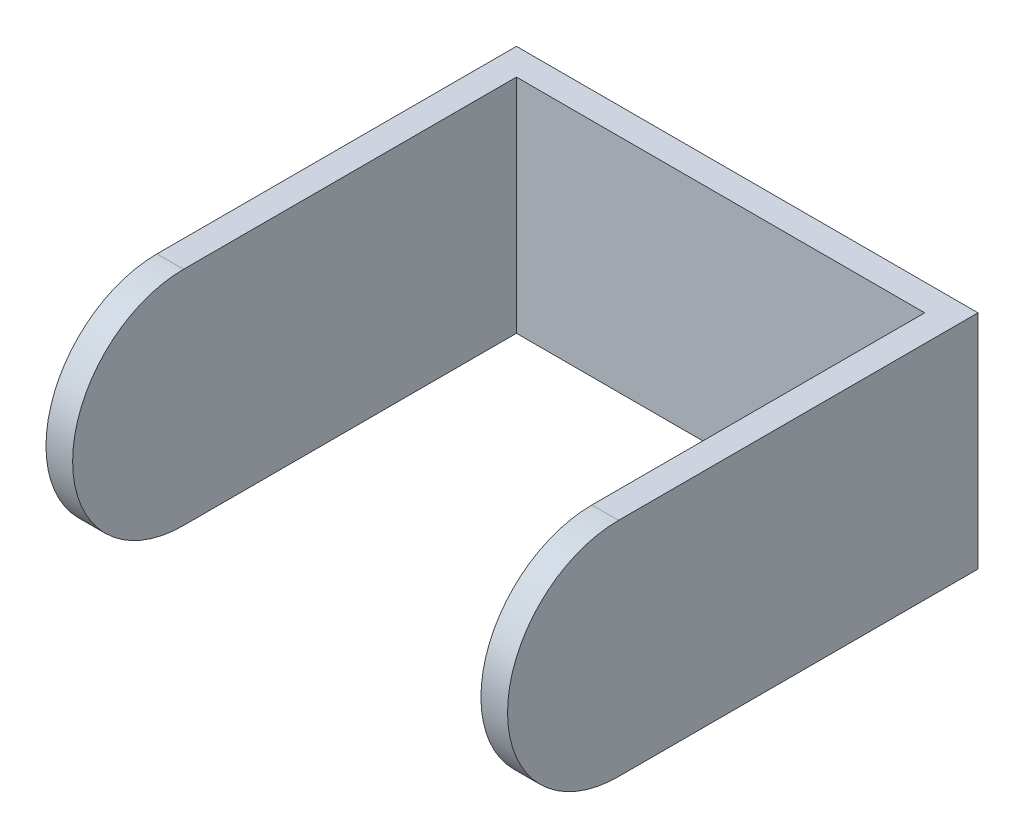
ISO-10303-21;
HEADER;
FILE_DESCRIPTION(('STEP AP214'),'2;1');
FILE_NAME('part.step','',(''),(''),'','','');
FILE_SCHEMA(('AUTOMOTIVE_DESIGN { 1 0 10303 214 1 1 1 1 }'));
ENDSEC;
DATA;
#1=APPLICATION_CONTEXT('core data for automotive mechanical design processes');
#2=APPLICATION_PROTOCOL_DEFINITION('international standard','automotive_design',2000,#1);
#3=PRODUCT_CONTEXT('',#1,'mechanical');
#4=PRODUCT('Part','Part','',(#3));
#5=PRODUCT_RELATED_PRODUCT_CATEGORY('part','',(#4));
#6=PRODUCT_DEFINITION_FORMATION('','',#4);
#7=PRODUCT_DEFINITION_CONTEXT('part definition',#1,'design');
#8=PRODUCT_DEFINITION('design','',#6,#7);
#9=PRODUCT_DEFINITION_SHAPE('','',#8);
#10=(LENGTH_UNIT() NAMED_UNIT(*) SI_UNIT(.MILLI.,.METRE.));
#11=(NAMED_UNIT(*) PLANE_ANGLE_UNIT() SI_UNIT($,.RADIAN.));
#12=(NAMED_UNIT(*) SI_UNIT($,.STERADIAN.) SOLID_ANGLE_UNIT());
#13=UNCERTAINTY_MEASURE_WITH_UNIT(LENGTH_MEASURE(1.E-05),#10,'distance_accuracy_value','');
#14=(GEOMETRIC_REPRESENTATION_CONTEXT(3) GLOBAL_UNCERTAINTY_ASSIGNED_CONTEXT((#13)) GLOBAL_UNIT_ASSIGNED_CONTEXT((#10,
#11,#12)) REPRESENTATION_CONTEXT('',''));
#15=CARTESIAN_POINT('',(0.,0.,0.));
#16=DIRECTION('',(0.,0.,1.));
#17=DIRECTION('',(1.,0.,0.));
#18=AXIS2_PLACEMENT_3D('',#15,#16,#17);
#19=CARTESIAN_POINT('',(-26.,12.5,3.));
#20=DIRECTION('',(1.,0.,0.));
#21=DIRECTION('',(0.,1.,0.));
#22=AXIS2_PLACEMENT_3D('',#19,#20,#21);
#23=PLANE('',#22);
#24=DIRECTION('',(0.,0.,-1.));
#25=VECTOR('',#24,1.);
#26=CARTESIAN_POINT('',(-26.,-12.5,3.));
#27=LINE('',#26,#25);
#28=CARTESIAN_POINT('',(-26.,-12.5,40.5));
#29=VERTEX_POINT('',#28);
#30=CARTESIAN_POINT('',(-26.,-12.5,0.));
#31=VERTEX_POINT('',#30);
#32=EDGE_CURVE('E11',#29,#31,#27,.T.);
#33=ORIENTED_EDGE('',*,*,#32,.F.);
#34=CARTESIAN_POINT('',(-26.,0.,40.5));
#35=DIRECTION('',(1.,0.,0.));
#36=DIRECTION('',(0.,1.,0.));
#37=AXIS2_PLACEMENT_3D('',#34,#35,#36);
#38=CIRCLE('',#37,12.5);
#39=CARTESIAN_POINT('',(-26.,12.5,40.5));
#40=VERTEX_POINT('',#39);
#41=EDGE_CURVE('E100',#40,#29,#38,.T.);
#42=ORIENTED_EDGE('',*,*,#41,.F.);
#43=DIRECTION('',(0.,0.,-1.));
#44=VECTOR('',#43,1.);
#45=CARTESIAN_POINT('',(-26.,12.5,3.));
#46=LINE('',#45,#44);
#47=CARTESIAN_POINT('',(-26.,12.5,0.));
#48=VERTEX_POINT('',#47);
#49=EDGE_CURVE('E120',#40,#48,#46,.T.);
#50=ORIENTED_EDGE('',*,*,#49,.T.);
#51=DIRECTION('',(0.,-1.,0.));
#52=VECTOR('',#51,1.);
#53=CARTESIAN_POINT('',(-26.,12.5,0.));
#54=LINE('',#53,#52);
#55=EDGE_CURVE('E119',#48,#31,#54,.T.);
#56=ORIENTED_EDGE('',*,*,#55,.T.);
#57=EDGE_LOOP('',(#33,#42,#50,#56));
#58=FACE_BOUND('',#57,.T.);
#59=ADVANCED_FACE('F34',(#58),#23,.F.);
#60=CARTESIAN_POINT('',(26.,12.5,3.));
#61=DIRECTION('',(-1.,0.,0.));
#62=DIRECTION('',(0.,-1.,0.));
#63=AXIS2_PLACEMENT_3D('',#60,#61,#62);
#64=PLANE('',#63);
#65=CARTESIAN_POINT('',(26.,0.,40.5));
#66=DIRECTION('',(1.,0.,0.));
#67=DIRECTION('',(0.,1.,0.));
#68=AXIS2_PLACEMENT_3D('',#65,#66,#67);
#69=CIRCLE('',#68,12.5);
#70=CARTESIAN_POINT('',(26.,12.5,40.5));
#71=VERTEX_POINT('',#70);
#72=CARTESIAN_POINT('',(26.,-12.5,40.5));
#73=VERTEX_POINT('',#72);
#74=EDGE_CURVE('E110',#71,#73,#69,.T.);
#75=ORIENTED_EDGE('',*,*,#74,.T.);
#76=DIRECTION('',(0.,0.,-1.));
#77=VECTOR('',#76,1.);
#78=CARTESIAN_POINT('',(26.,-12.5,3.));
#79=LINE('',#78,#77);
#80=CARTESIAN_POINT('',(26.,-12.5,0.));
#81=VERTEX_POINT('',#80);
#82=EDGE_CURVE('E41',#73,#81,#79,.T.);
#83=ORIENTED_EDGE('',*,*,#82,.T.);
#84=DIRECTION('',(0.,1.,0.));
#85=VECTOR('',#84,1.);
#86=CARTESIAN_POINT('',(26.,12.5,0.));
#87=LINE('',#86,#85);
#88=CARTESIAN_POINT('',(26.,12.5,0.));
#89=VERTEX_POINT('',#88);
#90=EDGE_CURVE('E126',#81,#89,#87,.T.);
#91=ORIENTED_EDGE('',*,*,#90,.T.);
#92=DIRECTION('',(0.,0.,-1.));
#93=VECTOR('',#92,1.);
#94=CARTESIAN_POINT('',(26.,12.5,3.));
#95=LINE('',#94,#93);
#96=EDGE_CURVE('E140',#71,#89,#95,.T.);
#97=ORIENTED_EDGE('',*,*,#96,.F.);
#98=EDGE_LOOP('',(#75,#83,#91,#97));
#99=FACE_BOUND('',#98,.T.);
#100=ADVANCED_FACE('F143',(#99),#64,.F.);
#101=CARTESIAN_POINT('',(-23.,12.5,53.));
#102=DIRECTION('',(-1.,0.,0.));
#103=DIRECTION('',(0.,0.,1.));
#104=AXIS2_PLACEMENT_3D('',#101,#102,#103);
#105=PLANE('',#104);
#106=CARTESIAN_POINT('',(-23.,0.,40.5));
#107=DIRECTION('',(-1.,0.,0.));
#108=DIRECTION('',(0.,0.,1.));
#109=AXIS2_PLACEMENT_3D('',#106,#107,#108);
#110=CIRCLE('',#109,12.5);
#111=CARTESIAN_POINT('',(-23.,-12.5,40.5));
#112=VERTEX_POINT('',#111);
#113=CARTESIAN_POINT('',(-23.,12.5,40.5));
#114=VERTEX_POINT('',#113);
#115=EDGE_CURVE('E161',#112,#114,#110,.T.);
#116=ORIENTED_EDGE('',*,*,#115,.F.);
#117=DIRECTION('',(0.,0.,-1.));
#118=VECTOR('',#117,1.);
#119=CARTESIAN_POINT('',(-23.,-12.5,53.));
#120=LINE('',#119,#118);
#121=CARTESIAN_POINT('',(-23.,-12.5,3.));
#122=VERTEX_POINT('',#121);
#123=EDGE_CURVE('E56',#112,#122,#120,.T.);
#124=ORIENTED_EDGE('',*,*,#123,.T.);
#125=DIRECTION('',(0.,1.,0.));
#126=VECTOR('',#125,1.);
#127=CARTESIAN_POINT('',(-23.,12.5,3.));
#128=LINE('',#127,#126);
#129=CARTESIAN_POINT('',(-23.,12.5,3.));
#130=VERTEX_POINT('',#129);
#131=EDGE_CURVE('E168',#122,#130,#128,.T.);
#132=ORIENTED_EDGE('',*,*,#131,.T.);
#133=DIRECTION('',(0.,0.,-1.));
#134=VECTOR('',#133,1.);
#135=CARTESIAN_POINT('',(-23.,12.5,53.));
#136=LINE('',#135,#134);
#137=EDGE_CURVE('E128',#114,#130,#136,.T.);
#138=ORIENTED_EDGE('',*,*,#137,.F.);
#139=EDGE_LOOP('',(#116,#124,#132,#138));
#140=FACE_BOUND('',#139,.T.);
#141=ADVANCED_FACE('F175',(#140),#105,.F.);
#142=CARTESIAN_POINT('',(23.,12.5,53.));
#143=DIRECTION('',(1.,0.,0.));
#144=DIRECTION('',(0.,0.,-1.));
#145=AXIS2_PLACEMENT_3D('',#142,#143,#144);
#146=PLANE('',#145);
#147=DIRECTION('',(0.,0.,-1.));
#148=VECTOR('',#147,1.);
#149=CARTESIAN_POINT('',(23.,-12.5,53.));
#150=LINE('',#149,#148);
#151=CARTESIAN_POINT('',(23.,-12.5,40.5));
#152=VERTEX_POINT('',#151);
#153=CARTESIAN_POINT('',(23.,-12.5,3.));
#154=VERTEX_POINT('',#153);
#155=EDGE_CURVE('E48',#152,#154,#150,.T.);
#156=ORIENTED_EDGE('',*,*,#155,.F.);
#157=CARTESIAN_POINT('',(23.,0.,40.5));
#158=DIRECTION('',(1.,0.,0.));
#159=DIRECTION('',(0.,0.,-1.));
#160=AXIS2_PLACEMENT_3D('',#157,#158,#159);
#161=CIRCLE('',#160,12.5);
#162=CARTESIAN_POINT('',(23.,12.5,40.5));
#163=VERTEX_POINT('',#162);
#164=EDGE_CURVE('E157',#163,#152,#161,.T.);
#165=ORIENTED_EDGE('',*,*,#164,.F.);
#166=DIRECTION('',(0.,0.,-1.));
#167=VECTOR('',#166,1.);
#168=CARTESIAN_POINT('',(23.,12.5,53.));
#169=LINE('',#168,#167);
#170=CARTESIAN_POINT('',(23.,12.5,3.));
#171=VERTEX_POINT('',#170);
#172=EDGE_CURVE('E153',#163,#171,#169,.T.);
#173=ORIENTED_EDGE('',*,*,#172,.T.);
#174=DIRECTION('',(0.,-1.,0.));
#175=VECTOR('',#174,1.);
#176=CARTESIAN_POINT('',(23.,12.5,3.));
#177=LINE('',#176,#175);
#178=EDGE_CURVE('E163',#171,#154,#177,.T.);
#179=ORIENTED_EDGE('',*,*,#178,.T.);
#180=EDGE_LOOP('',(#156,#165,#173,#179));
#181=FACE_BOUND('',#180,.T.);
#182=ADVANCED_FACE('F177',(#181),#146,.F.);
#183=CARTESIAN_POINT('',(-26.,-12.5,3.));
#184=DIRECTION('',(0.,1.,0.));
#185=DIRECTION('',(-1.,0.,0.));
#186=AXIS2_PLACEMENT_3D('',#183,#184,#185);
#187=PLANE('',#186);
#188=DIRECTION('',(1.,0.,0.));
#189=VECTOR('',#188,1.);
#190=CARTESIAN_POINT('',(-26.,-12.5,40.5));
#191=LINE('',#190,#189);
#192=EDGE_CURVE('E103',#29,#112,#191,.T.);
#193=ORIENTED_EDGE('',*,*,#192,.F.);
#194=ORIENTED_EDGE('',*,*,#32,.T.);
#195=DIRECTION('',(1.,0.,0.));
#196=VECTOR('',#195,1.);
#197=CARTESIAN_POINT('',(-26.,-12.5,0.));
#198=LINE('',#197,#196);
#199=EDGE_CURVE('E124',#31,#81,#198,.T.);
#200=ORIENTED_EDGE('',*,*,#199,.T.);
#201=ORIENTED_EDGE('',*,*,#82,.F.);
#202=EDGE_CURVE('E115',#152,#73,#191,.T.);
#203=ORIENTED_EDGE('',*,*,#202,.F.);
#204=ORIENTED_EDGE('',*,*,#155,.T.);
#205=DIRECTION('',(1.,0.,0.));
#206=VECTOR('',#205,1.);
#207=CARTESIAN_POINT('',(-26.,-12.5,3.));
#208=LINE('',#207,#206);
#209=EDGE_CURVE('E138',#122,#154,#208,.T.);
#210=ORIENTED_EDGE('',*,*,#209,.F.);
#211=ORIENTED_EDGE('',*,*,#123,.F.);
#212=EDGE_LOOP('',(#193,#194,#200,#201,#203,#204,#210,#211));
#213=FACE_BOUND('',#212,.T.);
#214=ADVANCED_FACE('F112',(#213),#187,.F.);
#215=CARTESIAN_POINT('',(0.,0.,3.));
#216=DIRECTION('',(0.,0.,1.));
#217=DIRECTION('',(1.,0.,0.));
#218=AXIS2_PLACEMENT_3D('',#215,#216,#217);
#219=PLANE('',#218);
#220=ORIENTED_EDGE('',*,*,#209,.T.);
#221=ORIENTED_EDGE('',*,*,#178,.F.);
#222=DIRECTION('',(-1.,0.,0.));
#223=VECTOR('',#222,1.);
#224=CARTESIAN_POINT('',(-26.,12.5,3.));
#225=LINE('',#224,#223);
#226=EDGE_CURVE('E131',#171,#130,#225,.T.);
#227=ORIENTED_EDGE('',*,*,#226,.T.);
#228=ORIENTED_EDGE('',*,*,#131,.F.);
#229=EDGE_LOOP('',(#220,#221,#227,#228));
#230=FACE_BOUND('',#229,.T.);
#231=ADVANCED_FACE('F173',(#230),#219,.T.);
#232=CARTESIAN_POINT('',(-26.,12.5,3.));
#233=DIRECTION('',(0.,-1.,0.));
#234=DIRECTION('',(0.,0.,-1.));
#235=AXIS2_PLACEMENT_3D('',#232,#233,#234);
#236=PLANE('',#235);
#237=ORIENTED_EDGE('',*,*,#49,.F.);
#238=DIRECTION('',(1.,0.,0.));
#239=VECTOR('',#238,1.);
#240=CARTESIAN_POINT('',(-26.,12.5,40.5));
#241=LINE('',#240,#239);
#242=EDGE_CURVE('E105',#40,#114,#241,.T.);
#243=ORIENTED_EDGE('',*,*,#242,.T.);
#244=ORIENTED_EDGE('',*,*,#137,.T.);
#245=ORIENTED_EDGE('',*,*,#226,.F.);
#246=ORIENTED_EDGE('',*,*,#172,.F.);
#247=EDGE_CURVE('E109',#163,#71,#241,.T.);
#248=ORIENTED_EDGE('',*,*,#247,.T.);
#249=ORIENTED_EDGE('',*,*,#96,.T.);
#250=DIRECTION('',(-1.,0.,0.));
#251=VECTOR('',#250,1.);
#252=CARTESIAN_POINT('',(-26.,12.5,0.));
#253=LINE('',#252,#251);
#254=EDGE_CURVE('E136',#89,#48,#253,.T.);
#255=ORIENTED_EDGE('',*,*,#254,.T.);
#256=EDGE_LOOP('',(#237,#243,#244,#245,#246,#248,#249,#255));
#257=FACE_BOUND('',#256,.T.);
#258=ADVANCED_FACE('F149',(#257),#236,.F.);
#259=CARTESIAN_POINT('',(0.,0.,0.));
#260=DIRECTION('',(0.,0.,1.));
#261=DIRECTION('',(1.,0.,0.));
#262=AXIS2_PLACEMENT_3D('',#259,#260,#261);
#263=PLANE('',#262);
#264=ORIENTED_EDGE('',*,*,#55,.F.);
#265=ORIENTED_EDGE('',*,*,#254,.F.);
#266=ORIENTED_EDGE('',*,*,#90,.F.);
#267=ORIENTED_EDGE('',*,*,#199,.F.);
#268=EDGE_LOOP('',(#264,#265,#266,#267));
#269=FACE_BOUND('',#268,.T.);
#270=ADVANCED_FACE('F147',(#269),#263,.F.);
#271=CARTESIAN_POINT('',(-26.,0.,40.5));
#272=DIRECTION('',(1.,0.,0.));
#273=DIRECTION('',(0.,1.,0.));
#274=AXIS2_PLACEMENT_3D('',#271,#272,#273);
#275=CYLINDRICAL_SURFACE('',#274,12.5);
#276=ORIENTED_EDGE('',*,*,#164,.T.);
#277=ORIENTED_EDGE('',*,*,#202,.T.);
#278=ORIENTED_EDGE('',*,*,#74,.F.);
#279=ORIENTED_EDGE('',*,*,#247,.F.);
#280=EDGE_LOOP('',(#276,#277,#278,#279));
#281=FACE_BOUND('',#280,.T.);
#282=ADVANCED_FACE('F232',(#281),#275,.T.);
#283=ORIENTED_EDGE('',*,*,#115,.T.);
#284=ORIENTED_EDGE('',*,*,#242,.F.);
#285=ORIENTED_EDGE('',*,*,#41,.T.);
#286=ORIENTED_EDGE('',*,*,#192,.T.);
#287=EDGE_LOOP('',(#283,#284,#285,#286));
#288=FACE_BOUND('',#287,.T.);
#289=ADVANCED_FACE('F102',(#288),#275,.T.);
#290=CLOSED_SHELL('',(#59,#100,#141,#182,#214,#231,#258,#270,#282,#289));
#291=MANIFOLD_SOLID_BREP('B2',#290);
#292=ADVANCED_BREP_SHAPE_REPRESENTATION('',(#18,#291),#14);
#293=SHAPE_DEFINITION_REPRESENTATION(#9,#292);
ENDSEC;
END-ISO-10303-21;
